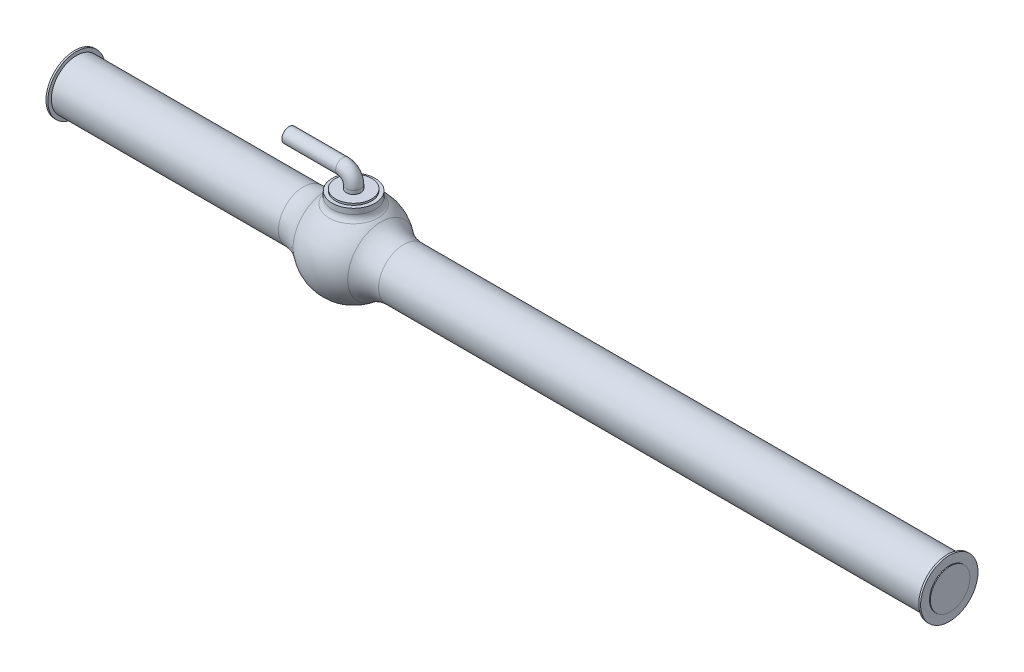
ISO-10303-21;
HEADER;
FILE_DESCRIPTION(('STEP AP214'),'2;1');
FILE_NAME('part.step','',(''),(''),'','','');
FILE_SCHEMA(('AUTOMOTIVE_DESIGN { 1 0 10303 214 1 1 1 1 }'));
ENDSEC;
DATA;
#1=APPLICATION_CONTEXT('core data for automotive mechanical design processes');
#2=APPLICATION_PROTOCOL_DEFINITION('international standard','automotive_design',2000,#1);
#3=PRODUCT_CONTEXT('',#1,'mechanical');
#4=PRODUCT('Part','Part','',(#3));
#5=PRODUCT_RELATED_PRODUCT_CATEGORY('part','',(#4));
#6=PRODUCT_DEFINITION_FORMATION('','',#4);
#7=PRODUCT_DEFINITION_CONTEXT('part definition',#1,'design');
#8=PRODUCT_DEFINITION('design','',#6,#7);
#9=PRODUCT_DEFINITION_SHAPE('','',#8);
#10=(LENGTH_UNIT() NAMED_UNIT(*) SI_UNIT(.MILLI.,.METRE.));
#11=(NAMED_UNIT(*) PLANE_ANGLE_UNIT() SI_UNIT($,.RADIAN.));
#12=(NAMED_UNIT(*) SI_UNIT($,.STERADIAN.) SOLID_ANGLE_UNIT());
#13=UNCERTAINTY_MEASURE_WITH_UNIT(LENGTH_MEASURE(1.E-05),#10,'distance_accuracy_value','');
#14=(GEOMETRIC_REPRESENTATION_CONTEXT(3) GLOBAL_UNCERTAINTY_ASSIGNED_CONTEXT((#13)) GLOBAL_UNIT_ASSIGNED_CONTEXT((#10,
#11,#12)) REPRESENTATION_CONTEXT('',''));
#15=CARTESIAN_POINT('',(0.,0.,0.));
#16=DIRECTION('',(0.,0.,1.));
#17=DIRECTION('',(1.,0.,0.));
#18=AXIS2_PLACEMENT_3D('',#15,#16,#17);
#19=CARTESIAN_POINT('',(0.,0.,0.));
#20=DIRECTION('',(0.,1.,0.));
#21=DIRECTION('',(0.,0.,-1.));
#22=AXIS2_PLACEMENT_3D('',#19,#20,#21);
#23=SPHERICAL_SURFACE('',#22,120.);
#24=CARTESIAN_POINT('',(0.,98.4782167977948,0.));
#25=DIRECTION('',(0.,-1.,0.));
#26=DIRECTION('',(0.,0.,-1.));
#27=AXIS2_PLACEMENT_3D('',#24,#25,#26);
#28=CIRCLE('',#27,68.5714285714286);
#29=CARTESIAN_POINT('',(0.,98.4782167977948,-68.5714285714286));
#30=VERTEX_POINT('',#29);
#31=EDGE_CURVE('E50',#30,#30,#28,.T.);
#32=ORIENTED_EDGE('',*,*,#31,.T.);
#33=EDGE_LOOP('',(#32));
#34=FACE_BOUND('',#33,.T.);
#35=CARTESIAN_POINT('',(76.1685820569215,0.,0.));
#36=DIRECTION('',(-1.,0.,0.));
#37=DIRECTION('',(0.,0.,1.));
#38=AXIS2_PLACEMENT_3D('',#35,#36,#37);
#39=CIRCLE('',#38,92.7272727272727);
#40=CARTESIAN_POINT('',(76.1685820569215,0.,92.7272727272727));
#41=VERTEX_POINT('',#40);
#42=EDGE_CURVE('E62',#41,#41,#39,.T.);
#43=ORIENTED_EDGE('',*,*,#42,.T.);
#44=EDGE_LOOP('',(#43));
#45=FACE_BOUND('',#44,.T.);
#46=CARTESIAN_POINT('',(-76.1685820569215,0.,0.));
#47=DIRECTION('',(1.,0.,0.));
#48=DIRECTION('',(0.,0.,-1.));
#49=AXIS2_PLACEMENT_3D('',#46,#47,#48);
#50=CIRCLE('',#49,92.7272727272727);
#51=CARTESIAN_POINT('',(-76.1685820569215,0.,-92.7272727272727));
#52=VERTEX_POINT('',#51);
#53=EDGE_CURVE('E65',#52,#52,#50,.T.);
#54=ORIENTED_EDGE('',*,*,#53,.T.);
#55=EDGE_LOOP('',(#54));
#56=FACE_BOUND('',#55,.T.);
#57=ADVANCED_FACE('F38',(#34,#45,#56),#23,.T.);
#58=CARTESIAN_POINT('',(0.,135.,0.));
#59=DIRECTION('',(0.,1.,0.));
#60=DIRECTION('',(0.,0.,1.));
#61=AXIS2_PLACEMENT_3D('',#58,#59,#60);
#62=PLANE('',#61);
#63=CARTESIAN_POINT('',(0.,135.,0.));
#64=DIRECTION('',(0.,1.,0.));
#65=DIRECTION('',(0.,0.,1.));
#66=AXIS2_PLACEMENT_3D('',#63,#64,#65);
#67=CIRCLE('',#66,50.);
#68=CARTESIAN_POINT('',(0.,135.,50.));
#69=VERTEX_POINT('',#68);
#70=EDGE_CURVE('E71',#69,#69,#67,.T.);
#71=ORIENTED_EDGE('',*,*,#70,.T.);
#72=EDGE_LOOP('',(#71));
#73=FACE_BOUND('',#72,.T.);
#74=CARTESIAN_POINT('',(0.,135.,0.));
#75=DIRECTION('',(0.,1.,0.));
#76=DIRECTION('',(0.,0.,1.));
#77=AXIS2_PLACEMENT_3D('',#74,#75,#76);
#78=CIRCLE('',#77,20.);
#79=CARTESIAN_POINT('',(0.,135.,20.));
#80=VERTEX_POINT('',#79);
#81=EDGE_CURVE('E81',#80,#80,#78,.T.);
#82=ORIENTED_EDGE('',*,*,#81,.F.);
#83=EDGE_LOOP('',(#82));
#84=FACE_BOUND('',#83,.T.);
#85=ADVANCED_FACE('F138',(#73,#84),#62,.T.);
#86=CARTESIAN_POINT('',(0.,135.,0.));
#87=DIRECTION('',(0.,-1.,0.));
#88=DIRECTION('',(0.,0.,-1.));
#89=AXIS2_PLACEMENT_3D('',#86,#87,#88);
#90=CYLINDRICAL_SURFACE('',#89,50.);
#91=ORIENTED_EDGE('',*,*,#70,.F.);
#92=EDGE_LOOP('',(#91));
#93=FACE_BOUND('',#92,.T.);
#94=CARTESIAN_POINT('',(0.,130.,0.));
#95=DIRECTION('',(0.,1.,0.));
#96=DIRECTION('',(0.,0.,1.));
#97=AXIS2_PLACEMENT_3D('',#94,#95,#96);
#98=CIRCLE('',#97,50.);
#99=CARTESIAN_POINT('',(0.,130.,50.));
#100=VERTEX_POINT('',#99);
#101=EDGE_CURVE('E84',#100,#100,#98,.T.);
#102=ORIENTED_EDGE('',*,*,#101,.T.);
#103=EDGE_LOOP('',(#102));
#104=FACE_BOUND('',#103,.T.);
#105=ADVANCED_FACE('F144',(#93,#104),#90,.T.);
#106=CARTESIAN_POINT('',(-30.,175.,-2.08166817117217E-13));
#107=DIRECTION('',(-1.,0.,0.));
#108=DIRECTION('',(0.,0.,1.));
#109=AXIS2_PLACEMENT_3D('',#106,#107,#108);
#110=CYLINDRICAL_SURFACE('',#109,20.);
#111=CARTESIAN_POINT('',(-30.,175.,-2.08166817117217E-13));
#112=DIRECTION('',(-1.,0.,0.));
#113=DIRECTION('',(0.,0.,1.));
#114=AXIS2_PLACEMENT_3D('',#111,#112,#113);
#115=CIRCLE('',#114,20.);
#116=CARTESIAN_POINT('',(-30.,195.,-2.08166817117217E-13));
#117=VERTEX_POINT('',#116);
#118=EDGE_CURVE('E77',#117,#117,#115,.T.);
#119=ORIENTED_EDGE('',*,*,#118,.T.);
#120=EDGE_LOOP('',(#119));
#121=FACE_BOUND('',#120,.T.);
#122=CARTESIAN_POINT('',(-180.,175.,-1.2490009027033E-12));
#123=DIRECTION('',(-1.,0.,0.));
#124=DIRECTION('',(0.,0.,1.));
#125=AXIS2_PLACEMENT_3D('',#122,#123,#124);
#126=CIRCLE('',#125,20.);
#127=CARTESIAN_POINT('',(-180.,175.,19.9999999999987));
#128=VERTEX_POINT('',#127);
#129=EDGE_CURVE('E74',#128,#128,#126,.T.);
#130=ORIENTED_EDGE('',*,*,#129,.F.);
#131=EDGE_LOOP('',(#130));
#132=FACE_BOUND('',#131,.T.);
#133=ADVANCED_FACE('F171',(#121,#132),#110,.T.);
#134=CARTESIAN_POINT('',(-30.,145.,-2.08166817117217E-13));
#135=DIRECTION('',(0.,0.,1.));
#136=DIRECTION('',(1.,0.,0.));
#137=AXIS2_PLACEMENT_3D('',#134,#135,#136);
#138=TOROIDAL_SURFACE('',#137,30.,20.);
#139=CARTESIAN_POINT('',(0.,145.,0.));
#140=DIRECTION('',(0.,1.,0.));
#141=DIRECTION('',(0.,0.,1.));
#142=AXIS2_PLACEMENT_3D('',#139,#140,#141);
#143=CIRCLE('',#142,20.);
#144=CARTESIAN_POINT('',(20.,145.,1.38777878078145E-13));
#145=VERTEX_POINT('',#144);
#146=EDGE_CURVE('E80',#145,#145,#143,.T.);
#147=CARTESIAN_POINT('',(-30.,145.,-2.08166817117217E-13));
#148=DIRECTION('',(0.,0.,1.));
#149=DIRECTION('',(1.,0.,0.));
#150=AXIS2_PLACEMENT_3D('',#147,#148,#149);
#151=CIRCLE('',#150,50.);
#152=EDGE_CURVE('',#145,#117,#151,.T.);
#153=ORIENTED_EDGE('',*,*,#146,.T.);
#154=ORIENTED_EDGE('',*,*,#118,.F.);
#155=ORIENTED_EDGE('',*,*,#152,.T.);
#156=ORIENTED_EDGE('',*,*,#152,.F.);
#157=EDGE_LOOP('',(#153,#155,#154,#156));
#158=FACE_BOUND('',#157,.T.);
#159=ADVANCED_FACE('F167',(#158),#138,.T.);
#160=CARTESIAN_POINT('',(0.,145.,0.));
#161=DIRECTION('',(0.,-1.,0.));
#162=DIRECTION('',(0.,0.,-1.));
#163=AXIS2_PLACEMENT_3D('',#160,#161,#162);
#164=CYLINDRICAL_SURFACE('',#163,20.);
#165=ORIENTED_EDGE('',*,*,#146,.F.);
#166=EDGE_LOOP('',(#165));
#167=FACE_BOUND('',#166,.T.);
#168=ORIENTED_EDGE('',*,*,#81,.T.);
#169=EDGE_LOOP('',(#168));
#170=FACE_BOUND('',#169,.T.);
#171=ADVANCED_FACE('F163',(#167,#170),#164,.T.);
#172=CARTESIAN_POINT('',(-180.,175.,-1.2490009027033E-12));
#173=DIRECTION('',(-1.,0.,0.));
#174=DIRECTION('',(0.,0.,1.));
#175=AXIS2_PLACEMENT_3D('',#172,#173,#174);
#176=PLANE('',#175);
#177=ORIENTED_EDGE('',*,*,#129,.T.);
#178=EDGE_LOOP('',(#177));
#179=FACE_BOUND('',#178,.T.);
#180=ADVANCED_FACE('F156',(#179),#176,.T.);
#181=CARTESIAN_POINT('',(0.,180.,0.));
#182=DIRECTION('',(0.,1.,0.));
#183=DIRECTION('',(0.,0.,1.));
#184=AXIS2_PLACEMENT_3D('',#181,#182,#183);
#185=CYLINDRICAL_SURFACE('',#184,60.);
#186=CARTESIAN_POINT('',(0.,114.891252930761,0.));
#187=DIRECTION('',(0.,-1.,0.));
#188=DIRECTION('',(0.,0.,-1.));
#189=AXIS2_PLACEMENT_3D('',#186,#187,#188);
#190=CIRCLE('',#189,60.);
#191=CARTESIAN_POINT('',(0.,114.891252930761,-60.));
#192=VERTEX_POINT('',#191);
#193=EDGE_CURVE('E54',#192,#192,#190,.F.);
#194=ORIENTED_EDGE('',*,*,#193,.T.);
#195=EDGE_LOOP('',(#194));
#196=FACE_BOUND('',#195,.T.);
#197=CARTESIAN_POINT('',(0.,130.,0.));
#198=DIRECTION('',(0.,1.,0.));
#199=DIRECTION('',(0.,0.,1.));
#200=AXIS2_PLACEMENT_3D('',#197,#198,#199);
#201=CIRCLE('',#200,60.);
#202=CARTESIAN_POINT('',(0.,130.,60.));
#203=VERTEX_POINT('',#202);
#204=EDGE_CURVE('E89',#203,#203,#201,.T.);
#205=ORIENTED_EDGE('',*,*,#204,.F.);
#206=EDGE_LOOP('',(#205));
#207=FACE_BOUND('',#206,.T.);
#208=ADVANCED_FACE('F152',(#196,#207),#185,.T.);
#209=CARTESIAN_POINT('',(0.,130.,-40.));
#210=DIRECTION('',(0.,1.,0.));
#211=DIRECTION('',(0.,0.,1.));
#212=AXIS2_PLACEMENT_3D('',#209,#210,#211);
#213=PLANE('',#212);
#214=ORIENTED_EDGE('',*,*,#204,.T.);
#215=EDGE_LOOP('',(#214));
#216=FACE_BOUND('',#215,.T.);
#217=ORIENTED_EDGE('',*,*,#101,.F.);
#218=EDGE_LOOP('',(#217));
#219=FACE_BOUND('',#218,.T.);
#220=ADVANCED_FACE('F155',(#216,#219),#213,.T.);
#221=CARTESIAN_POINT('',(-180.001,0.,0.));
#222=DIRECTION('',(1.,0.,0.));
#223=DIRECTION('',(0.,0.,-1.));
#224=AXIS2_PLACEMENT_3D('',#221,#222,#223);
#225=CYLINDRICAL_SURFACE('',#224,70.);
#226=CARTESIAN_POINT('',(139.642400437689,0.,0.));
#227=DIRECTION('',(-1.,0.,0.));
#228=DIRECTION('',(0.,0.,1.));
#229=AXIS2_PLACEMENT_3D('',#226,#227,#228);
#230=CIRCLE('',#229,70.);
#231=CARTESIAN_POINT('',(139.642400437689,0.,70.));
#232=VERTEX_POINT('',#231);
#233=EDGE_CURVE('E68',#232,#232,#230,.F.);
#234=ORIENTED_EDGE('',*,*,#233,.T.);
#235=EDGE_LOOP('',(#234));
#236=FACE_BOUND('',#235,.T.);
#237=CARTESIAN_POINT('',(1655.81096,0.,0.));
#238=DIRECTION('',(1.,0.,0.));
#239=DIRECTION('',(0.,0.,-1.));
#240=AXIS2_PLACEMENT_3D('',#237,#238,#239);
#241=CIRCLE('',#240,70.);
#242=CARTESIAN_POINT('',(1655.81096,0.,-70.));
#243=VERTEX_POINT('',#242);
#244=EDGE_CURVE('E92',#243,#243,#241,.T.);
#245=ORIENTED_EDGE('',*,*,#244,.F.);
#246=EDGE_LOOP('',(#245));
#247=FACE_BOUND('',#246,.T.);
#248=ADVANCED_FACE('F150',(#236,#247),#225,.T.);
#249=CARTESIAN_POINT('',(1655.81196,0.,0.));
#250=DIRECTION('',(-1.,0.,0.));
#251=DIRECTION('',(0.,0.,1.));
#252=AXIS2_PLACEMENT_3D('',#249,#250,#251);
#253=CYLINDRICAL_SURFACE('',#252,70.);
#254=CARTESIAN_POINT('',(-139.64240043769,0.,0.));
#255=DIRECTION('',(1.,0.,0.));
#256=DIRECTION('',(0.,0.,-1.));
#257=AXIS2_PLACEMENT_3D('',#254,#255,#256);
#258=CIRCLE('',#257,70.);
#259=CARTESIAN_POINT('',(-139.64240043769,0.,-70.));
#260=VERTEX_POINT('',#259);
#261=EDGE_CURVE('E59',#260,#260,#258,.F.);
#262=ORIENTED_EDGE('',*,*,#261,.T.);
#263=EDGE_LOOP('',(#262));
#264=FACE_BOUND('',#263,.T.);
#265=CARTESIAN_POINT('',(-772.71178,0.,0.));
#266=DIRECTION('',(-1.,0.,0.));
#267=DIRECTION('',(0.,0.,1.));
#268=AXIS2_PLACEMENT_3D('',#265,#266,#267);
#269=CIRCLE('',#268,70.);
#270=CARTESIAN_POINT('',(-772.71178,0.,70.));
#271=VERTEX_POINT('',#270);
#272=EDGE_CURVE('E104',#271,#271,#269,.T.);
#273=ORIENTED_EDGE('',*,*,#272,.F.);
#274=EDGE_LOOP('',(#273));
#275=FACE_BOUND('',#274,.T.);
#276=ADVANCED_FACE('F201',(#264,#275),#253,.T.);
#277=CARTESIAN_POINT('',(1660.81096,0.,0.));
#278=DIRECTION('',(1.,0.,0.));
#279=DIRECTION('',(0.,0.,-1.));
#280=AXIS2_PLACEMENT_3D('',#277,#278,#279);
#281=PLANE('',#280);
#282=CARTESIAN_POINT('',(1660.81096,0.,0.));
#283=DIRECTION('',(1.,0.,0.));
#284=DIRECTION('',(0.,0.,-1.));
#285=AXIS2_PLACEMENT_3D('',#282,#283,#284);
#286=CIRCLE('',#285,80.);
#287=CARTESIAN_POINT('',(1660.81096,0.,-80.));
#288=VERTEX_POINT('',#287);
#289=EDGE_CURVE('E95',#288,#288,#286,.T.);
#290=ORIENTED_EDGE('',*,*,#289,.T.);
#291=EDGE_LOOP('',(#290));
#292=FACE_BOUND('',#291,.T.);
#293=CARTESIAN_POINT('',(1660.81096,0.,0.));
#294=DIRECTION('',(1.,0.,0.));
#295=DIRECTION('',(0.,0.,-1.));
#296=AXIS2_PLACEMENT_3D('',#293,#294,#295);
#297=CIRCLE('',#296,55.1936985);
#298=CARTESIAN_POINT('',(1660.81096,0.,-55.1936985));
#299=VERTEX_POINT('',#298);
#300=EDGE_CURVE('E99',#299,#299,#297,.T.);
#301=ORIENTED_EDGE('',*,*,#300,.F.);
#302=EDGE_LOOP('',(#301));
#303=FACE_BOUND('',#302,.T.);
#304=ADVANCED_FACE('F204',(#292,#303),#281,.T.);
#305=CARTESIAN_POINT('',(1655.81096,0.,0.));
#306=DIRECTION('',(1.,0.,0.));
#307=DIRECTION('',(0.,0.,-1.));
#308=AXIS2_PLACEMENT_3D('',#305,#306,#307);
#309=PLANE('',#308);
#310=ORIENTED_EDGE('',*,*,#244,.T.);
#311=EDGE_LOOP('',(#310));
#312=FACE_BOUND('',#311,.T.);
#313=CARTESIAN_POINT('',(1655.81096,0.,0.));
#314=DIRECTION('',(1.,0.,0.));
#315=DIRECTION('',(0.,0.,-1.));
#316=AXIS2_PLACEMENT_3D('',#313,#314,#315);
#317=CIRCLE('',#316,80.);
#318=CARTESIAN_POINT('',(1655.81096,0.,-80.));
#319=VERTEX_POINT('',#318);
#320=EDGE_CURVE('E96',#319,#319,#317,.T.);
#321=ORIENTED_EDGE('',*,*,#320,.F.);
#322=EDGE_LOOP('',(#321));
#323=FACE_BOUND('',#322,.T.);
#324=ADVANCED_FACE('F219',(#312,#323),#309,.F.);
#325=CARTESIAN_POINT('',(1660.81096,0.,0.));
#326=DIRECTION('',(-1.,0.,0.));
#327=DIRECTION('',(0.,0.,1.));
#328=AXIS2_PLACEMENT_3D('',#325,#326,#327);
#329=CYLINDRICAL_SURFACE('',#328,80.);
#330=ORIENTED_EDGE('',*,*,#289,.F.);
#331=EDGE_LOOP('',(#330));
#332=FACE_BOUND('',#331,.T.);
#333=ORIENTED_EDGE('',*,*,#320,.T.);
#334=EDGE_LOOP('',(#333));
#335=FACE_BOUND('',#334,.T.);
#336=ADVANCED_FACE('F210',(#332,#335),#329,.T.);
#337=CARTESIAN_POINT('',(-772.71178,0.,0.));
#338=DIRECTION('',(-1.,0.,0.));
#339=DIRECTION('',(0.,0.,1.));
#340=AXIS2_PLACEMENT_3D('',#337,#338,#339);
#341=PLANE('',#340);
#342=CARTESIAN_POINT('',(-772.71178,0.,0.));
#343=DIRECTION('',(-1.,0.,0.));
#344=DIRECTION('',(0.,0.,1.));
#345=AXIS2_PLACEMENT_3D('',#342,#343,#344);
#346=CIRCLE('',#345,80.);
#347=CARTESIAN_POINT('',(-772.71178,0.,80.));
#348=VERTEX_POINT('',#347);
#349=EDGE_CURVE('E108',#348,#348,#346,.T.);
#350=ORIENTED_EDGE('',*,*,#349,.F.);
#351=EDGE_LOOP('',(#350));
#352=FACE_BOUND('',#351,.T.);
#353=ORIENTED_EDGE('',*,*,#272,.T.);
#354=EDGE_LOOP('',(#353));
#355=FACE_BOUND('',#354,.T.);
#356=ADVANCED_FACE('F207',(#352,#355),#341,.F.);
#357=CARTESIAN_POINT('',(-777.71178,0.,0.));
#358=DIRECTION('',(-1.,0.,0.));
#359=DIRECTION('',(0.,0.,1.));
#360=AXIS2_PLACEMENT_3D('',#357,#358,#359);
#361=PLANE('',#360);
#362=CARTESIAN_POINT('',(-777.71178,0.,0.));
#363=DIRECTION('',(-1.,0.,0.));
#364=DIRECTION('',(0.,0.,1.));
#365=AXIS2_PLACEMENT_3D('',#362,#363,#364);
#366=CIRCLE('',#365,80.);
#367=CARTESIAN_POINT('',(-777.71178,0.,80.));
#368=VERTEX_POINT('',#367);
#369=EDGE_CURVE('E107',#368,#368,#366,.T.);
#370=ORIENTED_EDGE('',*,*,#369,.T.);
#371=EDGE_LOOP('',(#370));
#372=FACE_BOUND('',#371,.T.);
#373=CARTESIAN_POINT('',(-777.71178,0.,0.));
#374=DIRECTION('',(-1.,0.,0.));
#375=DIRECTION('',(0.,0.,1.));
#376=AXIS2_PLACEMENT_3D('',#373,#374,#375);
#377=CIRCLE('',#376,55.1936985);
#378=CARTESIAN_POINT('',(-777.71178,0.,55.1936985));
#379=VERTEX_POINT('',#378);
#380=EDGE_CURVE('E111',#379,#379,#377,.T.);
#381=ORIENTED_EDGE('',*,*,#380,.F.);
#382=EDGE_LOOP('',(#381));
#383=FACE_BOUND('',#382,.T.);
#384=ADVANCED_FACE('F209',(#372,#383),#361,.T.);
#385=CARTESIAN_POINT('',(-777.71178,0.,0.));
#386=DIRECTION('',(1.,0.,0.));
#387=DIRECTION('',(0.,0.,-1.));
#388=AXIS2_PLACEMENT_3D('',#385,#386,#387);
#389=CYLINDRICAL_SURFACE('',#388,80.);
#390=ORIENTED_EDGE('',*,*,#369,.F.);
#391=EDGE_LOOP('',(#390));
#392=FACE_BOUND('',#391,.T.);
#393=ORIENTED_EDGE('',*,*,#349,.T.);
#394=EDGE_LOOP('',(#393));
#395=FACE_BOUND('',#394,.T.);
#396=ADVANCED_FACE('F188',(#392,#395),#389,.T.);
#397=CARTESIAN_POINT('',(139.642400437689,0.,0.));
#398=DIRECTION('',(-1.,0.,0.));
#399=DIRECTION('',(0.,0.,1.));
#400=AXIS2_PLACEMENT_3D('',#397,#398,#399);
#401=TOROIDAL_SURFACE('',#400,170.,100.);
#402=ORIENTED_EDGE('',*,*,#42,.F.);
#403=EDGE_LOOP('',(#402));
#404=FACE_BOUND('',#403,.T.);
#405=ORIENTED_EDGE('',*,*,#233,.F.);
#406=EDGE_LOOP('',(#405));
#407=FACE_BOUND('',#406,.T.);
#408=ADVANCED_FACE('F185',(#404,#407),#401,.F.);
#409=CARTESIAN_POINT('',(-139.642400437689,0.,0.));
#410=DIRECTION('',(1.,0.,0.));
#411=DIRECTION('',(0.,0.,-1.));
#412=AXIS2_PLACEMENT_3D('',#409,#410,#411);
#413=TOROIDAL_SURFACE('',#412,170.,100.);
#414=ORIENTED_EDGE('',*,*,#53,.F.);
#415=EDGE_LOOP('',(#414));
#416=FACE_BOUND('',#415,.T.);
#417=ORIENTED_EDGE('',*,*,#261,.F.);
#418=EDGE_LOOP('',(#417));
#419=FACE_BOUND('',#418,.T.);
#420=ADVANCED_FACE('F187',(#416,#419),#413,.F.);
#421=CARTESIAN_POINT('',(0.,114.891252930761,0.));
#422=DIRECTION('',(0.,-1.,0.));
#423=DIRECTION('',(0.,0.,-1.));
#424=AXIS2_PLACEMENT_3D('',#421,#422,#423);
#425=TOROIDAL_SURFACE('',#424,80.,20.);
#426=ORIENTED_EDGE('',*,*,#31,.F.);
#427=EDGE_LOOP('',(#426));
#428=FACE_BOUND('',#427,.T.);
#429=ORIENTED_EDGE('',*,*,#193,.F.);
#430=EDGE_LOOP('',(#429));
#431=FACE_BOUND('',#430,.T.);
#432=ADVANCED_FACE('F40',(#428,#431),#425,.F.);
#433=CARTESIAN_POINT('',(-780.21178,0.,0.));
#434=DIRECTION('',(-1.,0.,0.));
#435=DIRECTION('',(0.,0.,1.));
#436=AXIS2_PLACEMENT_3D('',#433,#434,#435);
#437=PLANE('',#436);
#438=CARTESIAN_POINT('',(-780.21178,0.,0.));
#439=DIRECTION('',(-1.,0.,0.));
#440=DIRECTION('',(0.,0.,1.));
#441=AXIS2_PLACEMENT_3D('',#438,#439,#440);
#442=CIRCLE('',#441,55.1936985);
#443=CARTESIAN_POINT('',(-780.21178,0.,55.1936985));
#444=VERTEX_POINT('',#443);
#445=EDGE_CURVE('E116',#444,#444,#442,.T.);
#446=ORIENTED_EDGE('',*,*,#445,.T.);
#447=EDGE_LOOP('',(#446));
#448=FACE_BOUND('',#447,.T.);
#449=ADVANCED_FACE('F195',(#448),#437,.T.);
#450=CARTESIAN_POINT('',(-780.21178,0.,0.));
#451=DIRECTION('',(1.,0.,0.));
#452=DIRECTION('',(0.,0.,-1.));
#453=AXIS2_PLACEMENT_3D('',#450,#451,#452);
#454=CYLINDRICAL_SURFACE('',#453,55.1936985);
#455=ORIENTED_EDGE('',*,*,#380,.T.);
#456=EDGE_LOOP('',(#455));
#457=FACE_BOUND('',#456,.T.);
#458=ORIENTED_EDGE('',*,*,#445,.F.);
#459=EDGE_LOOP('',(#458));
#460=FACE_BOUND('',#459,.T.);
#461=ADVANCED_FACE('F133',(#457,#460),#454,.T.);
#462=CARTESIAN_POINT('',(1663.31096,0.,0.));
#463=DIRECTION('',(1.,0.,0.));
#464=DIRECTION('',(0.,0.,-1.));
#465=AXIS2_PLACEMENT_3D('',#462,#463,#464);
#466=PLANE('',#465);
#467=CARTESIAN_POINT('',(1663.31096,0.,0.));
#468=DIRECTION('',(1.,0.,0.));
#469=DIRECTION('',(0.,0.,-1.));
#470=AXIS2_PLACEMENT_3D('',#467,#468,#469);
#471=CIRCLE('',#470,55.1936985);
#472=CARTESIAN_POINT('',(1663.31096,0.,-55.1936985));
#473=VERTEX_POINT('',#472);
#474=EDGE_CURVE('E119',#473,#473,#471,.T.);
#475=ORIENTED_EDGE('',*,*,#474,.T.);
#476=EDGE_LOOP('',(#475));
#477=FACE_BOUND('',#476,.T.);
#478=ADVANCED_FACE('F123',(#477),#466,.T.);
#479=CARTESIAN_POINT('',(1663.31096,0.,0.));
#480=DIRECTION('',(-1.,0.,0.));
#481=DIRECTION('',(0.,0.,1.));
#482=AXIS2_PLACEMENT_3D('',#479,#480,#481);
#483=CYLINDRICAL_SURFACE('',#482,55.1936985);
#484=ORIENTED_EDGE('',*,*,#300,.T.);
#485=EDGE_LOOP('',(#484));
#486=FACE_BOUND('',#485,.T.);
#487=ORIENTED_EDGE('',*,*,#474,.F.);
#488=EDGE_LOOP('',(#487));
#489=FACE_BOUND('',#488,.T.);
#490=ADVANCED_FACE('F125',(#486,#489),#483,.T.);
#491=CLOSED_SHELL('',(#57,#85,#105,#133,#159,#171,#180,#208,#220,#248,#276,#304,#324,#336,#356,
#384,#396,#408,#420,#432,#449,#461,#478,#490));
#492=CARTESIAN_POINT('',(1658.31096,0.,0.));
#493=DIRECTION('',(1.,0.,0.));
#494=DIRECTION('',(0.,0.,-1.));
#495=AXIS2_PLACEMENT_3D('',#492,#493,#494);
#496=PLANE('',#495);
#497=CARTESIAN_POINT('',(1658.31096,0.,5.79944928080778E-12));
#498=DIRECTION('',(1.,0.,0.));
#499=DIRECTION('',(0.,0.,-1.));
#500=AXIS2_PLACEMENT_3D('',#497,#498,#499);
#501=CIRCLE('',#500,55.1936985);
#502=CARTESIAN_POINT('',(1658.31096,0.,-55.1936984999942));
#503=VERTEX_POINT('',#502);
#504=EDGE_CURVE('E10',#503,#503,#501,.F.);
#505=ORIENTED_EDGE('',*,*,#504,.T.);
#506=EDGE_LOOP('',(#505));
#507=FACE_BOUND('',#506,.T.);
#508=ADVANCED_FACE('F341',(#507),#496,.F.);
#509=CARTESIAN_POINT('',(-775.21178,0.,0.));
#510=DIRECTION('',(-1.,0.,0.));
#511=DIRECTION('',(0.,0.,1.));
#512=AXIS2_PLACEMENT_3D('',#509,#510,#511);
#513=PLANE('',#512);
#514=CARTESIAN_POINT('',(-775.21178,0.,-2.71107259641745E-12));
#515=DIRECTION('',(-1.,0.,0.));
#516=DIRECTION('',(0.,0.,1.));
#517=AXIS2_PLACEMENT_3D('',#514,#515,#516);
#518=CIRCLE('',#517,55.1936985);
#519=CARTESIAN_POINT('',(-775.21178,0.,55.1936984999973));
#520=VERTEX_POINT('',#519);
#521=EDGE_CURVE('E46',#520,#520,#518,.F.);
#522=ORIENTED_EDGE('',*,*,#521,.T.);
#523=EDGE_LOOP('',(#522));
#524=FACE_BOUND('',#523,.T.);
#525=ADVANCED_FACE('F182',(#524),#513,.F.);
#526=CARTESIAN_POINT('',(100.,0.,3.49720252756926E-13));
#527=DIRECTION('',(-1.,0.,0.));
#528=DIRECTION('',(0.,0.,1.));
#529=AXIS2_PLACEMENT_3D('',#526,#527,#528);
#530=CYLINDRICAL_SURFACE('',#529,55.1936985);
#531=ORIENTED_EDGE('',*,*,#521,.F.);
#532=EDGE_LOOP('',(#531));
#533=FACE_BOUND('',#532,.T.);
#534=ORIENTED_EDGE('',*,*,#504,.F.);
#535=EDGE_LOOP('',(#534));
#536=FACE_BOUND('',#535,.T.);
#537=ADVANCED_FACE('F179',(#533,#536),#530,.F.);
#538=CLOSED_SHELL('',(#508,#525,#537));
#539=ORIENTED_CLOSED_SHELL('',*,#538,.T.);
#540=BREP_WITH_VOIDS('B2',#491,(#539));
#541=ADVANCED_BREP_SHAPE_REPRESENTATION('',(#18,#540),#14);
#542=SHAPE_DEFINITION_REPRESENTATION(#9,#541);
ENDSEC;
END-ISO-10303-21;
